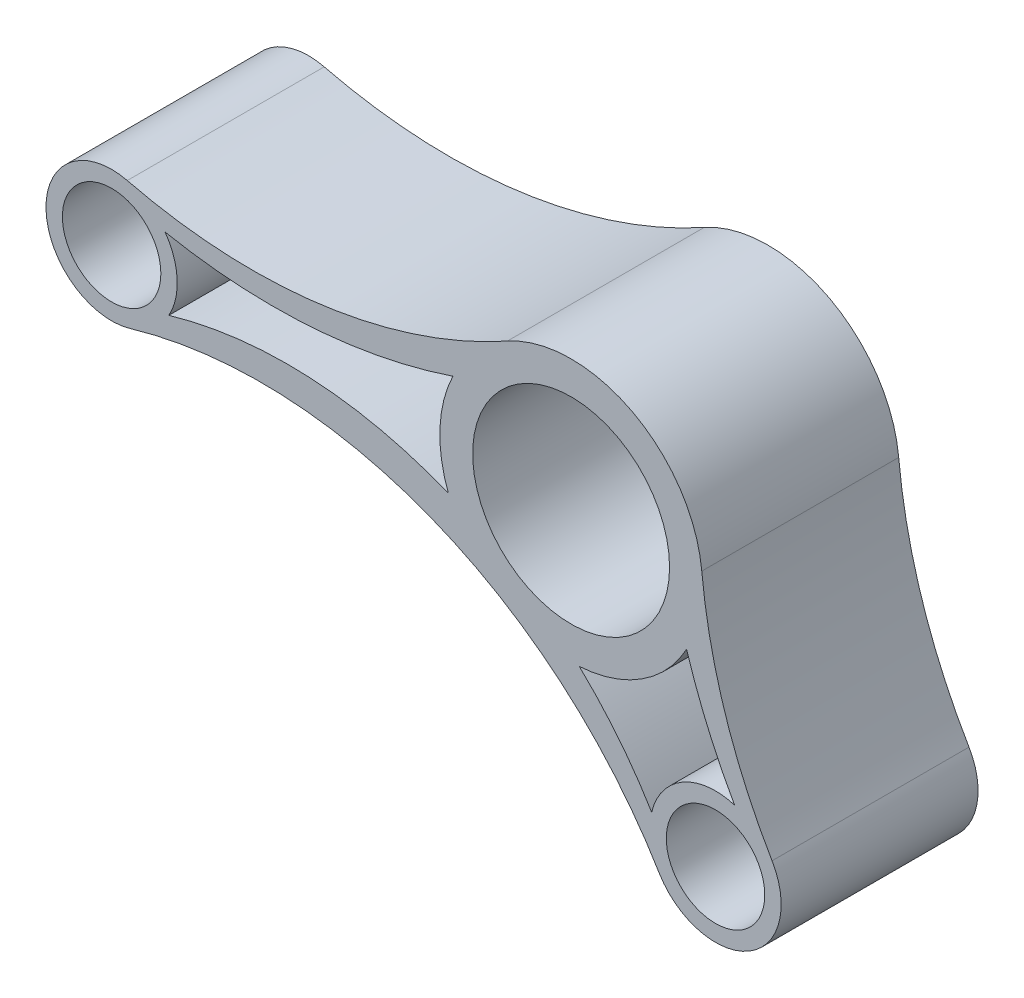
ISO-10303-21;
HEADER;
FILE_DESCRIPTION(('STEP AP214'),'2;1');
FILE_NAME('part.step','',(''),(''),'','','');
FILE_SCHEMA(('AUTOMOTIVE_DESIGN { 1 0 10303 214 1 1 1 1 }'));
ENDSEC;
DATA;
#1=APPLICATION_CONTEXT('core data for automotive mechanical design processes');
#2=APPLICATION_PROTOCOL_DEFINITION('international standard','automotive_design',2000,#1);
#3=PRODUCT_CONTEXT('',#1,'mechanical');
#4=PRODUCT('Part','Part','',(#3));
#5=PRODUCT_RELATED_PRODUCT_CATEGORY('part','',(#4));
#6=PRODUCT_DEFINITION_FORMATION('','',#4);
#7=PRODUCT_DEFINITION_CONTEXT('part definition',#1,'design');
#8=PRODUCT_DEFINITION('design','',#6,#7);
#9=PRODUCT_DEFINITION_SHAPE('','',#8);
#10=(LENGTH_UNIT() NAMED_UNIT(*) SI_UNIT(.MILLI.,.METRE.));
#11=(NAMED_UNIT(*) PLANE_ANGLE_UNIT() SI_UNIT($,.RADIAN.));
#12=(NAMED_UNIT(*) SI_UNIT($,.STERADIAN.) SOLID_ANGLE_UNIT());
#13=UNCERTAINTY_MEASURE_WITH_UNIT(LENGTH_MEASURE(1.E-05),#10,'distance_accuracy_value','');
#14=(GEOMETRIC_REPRESENTATION_CONTEXT(3) GLOBAL_UNCERTAINTY_ASSIGNED_CONTEXT((#13)) GLOBAL_UNIT_ASSIGNED_CONTEXT((#10,
#11,#12)) REPRESENTATION_CONTEXT('',''));
#15=CARTESIAN_POINT('',(0.,0.,0.));
#16=DIRECTION('',(0.,0.,1.));
#17=DIRECTION('',(1.,0.,0.));
#18=AXIS2_PLACEMENT_3D('',#15,#16,#17);
#19=CARTESIAN_POINT('',(-48.5714285714286,87.411763090162,15.));
#20=DIRECTION('',(0.,0.,-1.));
#21=DIRECTION('',(-1.,0.,0.));
#22=AXIS2_PLACEMENT_3D('',#19,#20,#21);
#23=CYLINDRICAL_SURFACE('',#22,80.);
#24=CARTESIAN_POINT('',(-48.5714285714286,87.411763090162,-15.));
#25=DIRECTION('',(0.,0.,1.));
#26=DIRECTION('',(1.,0.,0.));
#27=AXIS2_PLACEMENT_3D('',#24,#25,#26);
#28=CIRCLE('',#27,80.);
#29=CARTESIAN_POINT('',(-67.6190476190476,9.71241812112912,-15.));
#30=VERTEX_POINT('',#29);
#31=CARTESIAN_POINT('',(-9.71428571428572,17.4823526180324,-15.));
#32=VERTEX_POINT('',#31);
#33=EDGE_CURVE('E212',#30,#32,#28,.T.);
#34=ORIENTED_EDGE('',*,*,#33,.F.);
#35=DIRECTION('',(0.,0.,-1.));
#36=VECTOR('',#35,1.);
#37=CARTESIAN_POINT('',(-67.6190476190476,9.71241812112912,15.));
#38=LINE('',#37,#36);
#39=CARTESIAN_POINT('',(-67.6190476190476,9.71241812112912,15.));
#40=VERTEX_POINT('',#39);
#41=EDGE_CURVE('E11',#40,#30,#38,.T.);
#42=ORIENTED_EDGE('',*,*,#41,.F.);
#43=CARTESIAN_POINT('',(-48.5714285714286,87.411763090162,15.));
#44=DIRECTION('',(0.,0.,1.));
#45=DIRECTION('',(1.,0.,0.));
#46=AXIS2_PLACEMENT_3D('',#43,#44,#45);
#47=CIRCLE('',#46,80.);
#48=CARTESIAN_POINT('',(-9.71428571428572,17.4823526180324,15.));
#49=VERTEX_POINT('',#48);
#50=EDGE_CURVE('E277',#40,#49,#47,.T.);
#51=ORIENTED_EDGE('',*,*,#50,.T.);
#52=DIRECTION('',(0.,0.,-1.));
#53=VECTOR('',#52,1.);
#54=CARTESIAN_POINT('',(-9.71428571428572,17.4823526180324,15.));
#55=LINE('',#54,#53);
#56=EDGE_CURVE('E114',#49,#32,#55,.T.);
#57=ORIENTED_EDGE('',*,*,#56,.T.);
#58=EDGE_LOOP('',(#34,#42,#51,#57));
#59=FACE_BOUND('',#58,.T.);
#60=ADVANCED_FACE('F43',(#59),#23,.F.);
#61=CARTESIAN_POINT('',(-70.,0.,15.));
#62=DIRECTION('',(0.,0.,-1.));
#63=DIRECTION('',(-1.,0.,0.));
#64=AXIS2_PLACEMENT_3D('',#61,#62,#63);
#65=CYLINDRICAL_SURFACE('',#64,10.);
#66=CARTESIAN_POINT('',(-70.,0.,-15.));
#67=DIRECTION('',(0.,0.,1.));
#68=DIRECTION('',(1.,0.,0.));
#69=AXIS2_PLACEMENT_3D('',#66,#67,#68);
#70=CIRCLE('',#69,10.);
#71=CARTESIAN_POINT('',(-67.1780982450955,-9.5935848610239,-15.));
#72=VERTEX_POINT('',#71);
#73=EDGE_CURVE('E210',#30,#72,#70,.T.);
#74=ORIENTED_EDGE('',*,*,#73,.T.);
#75=DIRECTION('',(0.,0.,-1.));
#76=VECTOR('',#75,1.);
#77=CARTESIAN_POINT('',(-67.1780982450955,-9.5935848610239,15.));
#78=LINE('',#77,#76);
#79=CARTESIAN_POINT('',(-67.1780982450955,-9.5935848610239,15.));
#80=VERTEX_POINT('',#79);
#81=EDGE_CURVE('E53',#80,#72,#78,.T.);
#82=ORIENTED_EDGE('',*,*,#81,.F.);
#83=CARTESIAN_POINT('',(-70.,0.,15.));
#84=DIRECTION('',(0.,0.,1.));
#85=DIRECTION('',(1.,0.,0.));
#86=AXIS2_PLACEMENT_3D('',#83,#84,#85);
#87=CIRCLE('',#86,10.);
#88=EDGE_CURVE('E282',#40,#80,#87,.T.);
#89=ORIENTED_EDGE('',*,*,#88,.F.);
#90=ORIENTED_EDGE('',*,*,#41,.T.);
#91=EDGE_LOOP('',(#74,#82,#89,#90));
#92=FACE_BOUND('',#91,.T.);
#93=ADVANCED_FACE('F319',(#92),#65,.T.);
#94=CARTESIAN_POINT('',(-47.2376125822558,-77.3850099324316,15.));
#95=DIRECTION('',(0.,0.,-1.));
#96=DIRECTION('',(-1.,0.,0.));
#97=AXIS2_PLACEMENT_3D('',#94,#95,#96);
#98=CYLINDRICAL_SURFACE('',#97,70.6632880757908);
#99=CARTESIAN_POINT('',(-47.2376125822558,-77.3850099324316,-15.));
#100=DIRECTION('',(0.,0.,1.));
#101=DIRECTION('',(1.,0.,0.));
#102=AXIS2_PLACEMENT_3D('',#99,#100,#101);
#103=CIRCLE('',#102,70.6632880757908);
#104=CARTESIAN_POINT('',(13.4164653792441,-41.1305880183742,-15.));
#105=VERTEX_POINT('',#104);
#106=EDGE_CURVE('E215',#105,#72,#103,.T.);
#107=ORIENTED_EDGE('',*,*,#106,.F.);
#108=DIRECTION('',(0.,0.,-1.));
#109=VECTOR('',#108,1.);
#110=CARTESIAN_POINT('',(13.4164653792441,-41.1305880183742,15.));
#111=LINE('',#110,#109);
#112=CARTESIAN_POINT('',(13.4164653792441,-41.1305880183742,15.));
#113=VERTEX_POINT('',#112);
#114=EDGE_CURVE('E173',#113,#105,#111,.T.);
#115=ORIENTED_EDGE('',*,*,#114,.F.);
#116=CARTESIAN_POINT('',(-47.2376125822558,-77.3850099324316,15.));
#117=DIRECTION('',(0.,0.,1.));
#118=DIRECTION('',(1.,0.,0.));
#119=AXIS2_PLACEMENT_3D('',#116,#117,#118);
#120=CIRCLE('',#119,70.6632880757908);
#121=EDGE_CURVE('E162',#113,#80,#120,.T.);
#122=ORIENTED_EDGE('',*,*,#121,.T.);
#123=ORIENTED_EDGE('',*,*,#81,.T.);
#124=EDGE_LOOP('',(#107,#115,#122,#123));
#125=FACE_BOUND('',#124,.T.);
#126=ADVANCED_FACE('F292',(#125),#98,.F.);
#127=CARTESIAN_POINT('',(22.,-36.,15.));
#128=DIRECTION('',(0.,0.,-1.));
#129=DIRECTION('',(-1.,0.,0.));
#130=AXIS2_PLACEMENT_3D('',#127,#128,#129);
#131=CYLINDRICAL_SURFACE('',#130,10.);
#132=CARTESIAN_POINT('',(22.,-36.,-15.));
#133=DIRECTION('',(0.,0.,1.));
#134=DIRECTION('',(1.,0.,0.));
#135=AXIS2_PLACEMENT_3D('',#132,#133,#134);
#136=CIRCLE('',#135,10.);
#137=CARTESIAN_POINT('',(30.6141500030566,-30.9209824055395,-15.));
#138=VERTEX_POINT('',#137);
#139=EDGE_CURVE('E169',#105,#138,#136,.T.);
#140=ORIENTED_EDGE('',*,*,#139,.T.);
#141=DIRECTION('',(0.,0.,-1.));
#142=VECTOR('',#141,1.);
#143=CARTESIAN_POINT('',(30.6141500030566,-30.9209824055395,15.));
#144=LINE('',#143,#142);
#145=CARTESIAN_POINT('',(30.6141500030566,-30.9209824055395,15.));
#146=VERTEX_POINT('',#145);
#147=EDGE_CURVE('E166',#146,#138,#144,.T.);
#148=ORIENTED_EDGE('',*,*,#147,.F.);
#149=CARTESIAN_POINT('',(22.,-36.,15.));
#150=DIRECTION('',(0.,0.,1.));
#151=DIRECTION('',(1.,0.,0.));
#152=AXIS2_PLACEMENT_3D('',#149,#150,#151);
#153=CIRCLE('',#152,10.);
#154=EDGE_CURVE('E155',#113,#146,#153,.T.);
#155=ORIENTED_EDGE('',*,*,#154,.F.);
#156=ORIENTED_EDGE('',*,*,#114,.T.);
#157=EDGE_LOOP('',(#140,#148,#155,#156));
#158=FACE_BOUND('',#157,.T.);
#159=ADVANCED_FACE('F167',(#158),#131,.T.);
#160=CARTESIAN_POINT('',(99.5273500275096,9.71115835014474,15.));
#161=DIRECTION('',(0.,0.,-1.));
#162=DIRECTION('',(-1.,0.,0.));
#163=AXIS2_PLACEMENT_3D('',#160,#161,#162);
#164=CYLINDRICAL_SURFACE('',#163,80.);
#165=CARTESIAN_POINT('',(99.5273500275096,9.71115835014474,-15.));
#166=DIRECTION('',(0.,0.,1.));
#167=DIRECTION('',(1.,0.,0.));
#168=AXIS2_PLACEMENT_3D('',#165,#166,#167);
#169=CIRCLE('',#168,80.);
#170=CARTESIAN_POINT('',(19.9054700055019,1.94223167002895,-15.));
#171=VERTEX_POINT('',#170);
#172=EDGE_CURVE('E218',#171,#138,#169,.T.);
#173=ORIENTED_EDGE('',*,*,#172,.F.);
#174=DIRECTION('',(0.,0.,-1.));
#175=VECTOR('',#174,1.);
#176=CARTESIAN_POINT('',(19.9054700055019,1.94223167002895,15.));
#177=LINE('',#176,#175);
#178=CARTESIAN_POINT('',(19.9054700055019,1.94223167002895,15.));
#179=VERTEX_POINT('',#178);
#180=EDGE_CURVE('E107',#179,#171,#177,.T.);
#181=ORIENTED_EDGE('',*,*,#180,.F.);
#182=CARTESIAN_POINT('',(99.5273500275096,9.71115835014474,15.));
#183=DIRECTION('',(0.,0.,1.));
#184=DIRECTION('',(1.,0.,0.));
#185=AXIS2_PLACEMENT_3D('',#182,#183,#184);
#186=CIRCLE('',#185,80.);
#187=EDGE_CURVE('E160',#179,#146,#186,.T.);
#188=ORIENTED_EDGE('',*,*,#187,.T.);
#189=ORIENTED_EDGE('',*,*,#147,.T.);
#190=EDGE_LOOP('',(#173,#181,#188,#189));
#191=FACE_BOUND('',#190,.T.);
#192=ADVANCED_FACE('F175',(#191),#164,.F.);
#193=CARTESIAN_POINT('',(-43.1236043976895,-66.8714334607621,15.));
#194=DIRECTION('',(0.,0.,-1.));
#195=DIRECTION('',(-1.,0.,0.));
#196=AXIS2_PLACEMENT_3D('',#193,#194,#195);
#197=CYLINDRICAL_SURFACE('',#196,64.5703077117687);
#198=CARTESIAN_POINT('',(-43.1236043976895,-66.8714334607621,-15.));
#199=DIRECTION('',(0.,0.,1.));
#200=DIRECTION('',(1.,0.,0.));
#201=AXIS2_PLACEMENT_3D('',#198,#199,#200);
#202=CIRCLE('',#201,64.5703077117687);
#203=CARTESIAN_POINT('',(-18.6975414651907,-7.09943259405106,-15.));
#204=VERTEX_POINT('',#203);
#205=CARTESIAN_POINT('',(-61.2876120254974,-4.90859407384059,-15.));
#206=VERTEX_POINT('',#205);
#207=EDGE_CURVE('E202',#204,#206,#202,.T.);
#208=ORIENTED_EDGE('',*,*,#207,.T.);
#209=DIRECTION('',(0.,0.,-1.));
#210=VECTOR('',#209,1.);
#211=CARTESIAN_POINT('',(-61.2876120254974,-4.90859407384059,15.));
#212=LINE('',#211,#210);
#213=CARTESIAN_POINT('',(-61.2876120254974,-4.90859407384059,15.));
#214=VERTEX_POINT('',#213);
#215=EDGE_CURVE('E231',#214,#206,#212,.T.);
#216=ORIENTED_EDGE('',*,*,#215,.F.);
#217=CARTESIAN_POINT('',(-43.1236043976895,-66.8714334607621,15.));
#218=DIRECTION('',(0.,0.,1.));
#219=DIRECTION('',(1.,0.,0.));
#220=AXIS2_PLACEMENT_3D('',#217,#218,#219);
#221=CIRCLE('',#220,64.5703077117687);
#222=CARTESIAN_POINT('',(-18.6975414651907,-7.09943259405106,15.));
#223=VERTEX_POINT('',#222);
#224=EDGE_CURVE('E271',#223,#214,#221,.T.);
#225=ORIENTED_EDGE('',*,*,#224,.F.);
#226=DIRECTION('',(0.,0.,-1.));
#227=VECTOR('',#226,1.);
#228=CARTESIAN_POINT('',(-18.6975414651907,-7.09943259405106,15.));
#229=LINE('',#228,#227);
#230=EDGE_CURVE('E235',#223,#204,#229,.T.);
#231=ORIENTED_EDGE('',*,*,#230,.T.);
#232=EDGE_LOOP('',(#208,#216,#225,#231));
#233=FACE_BOUND('',#232,.T.);
#234=ADVANCED_FACE('F304',(#233),#197,.T.);
#235=CARTESIAN_POINT('',(-61.8505528905789,5.79538711483095,-15.));
#236=VERTEX_POINT('',#235);
#237=EDGE_CURVE('E207',#206,#236,#70,.T.);
#238=ORIENTED_EDGE('',*,*,#237,.T.);
#239=DIRECTION('',(0.,0.,-1.));
#240=VECTOR('',#239,1.);
#241=CARTESIAN_POINT('',(-61.8505528905789,5.79538711483095,15.));
#242=LINE('',#241,#240);
#243=CARTESIAN_POINT('',(-61.8505528905789,5.79538711483095,15.));
#244=VERTEX_POINT('',#243);
#245=EDGE_CURVE('E241',#244,#236,#242,.T.);
#246=ORIENTED_EDGE('',*,*,#245,.F.);
#247=EDGE_CURVE('E274',#214,#244,#87,.T.);
#248=ORIENTED_EDGE('',*,*,#247,.F.);
#249=ORIENTED_EDGE('',*,*,#215,.T.);
#250=EDGE_LOOP('',(#238,#246,#248,#249));
#251=FACE_BOUND('',#250,.T.);
#252=ADVANCED_FACE('F307',(#251),#65,.T.);
#253=CARTESIAN_POINT('',(-45.4196428571428,90.2111747109503,15.));
#254=DIRECTION('',(0.,0.,-1.));
#255=DIRECTION('',(-1.,0.,0.));
#256=AXIS2_PLACEMENT_3D('',#253,#254,#255);
#257=CYLINDRICAL_SURFACE('',#256,86.);
#258=CARTESIAN_POINT('',(-45.4196428571428,90.2111747109503,-15.));
#259=DIRECTION('',(0.,0.,1.));
#260=DIRECTION('',(1.,0.,0.));
#261=AXIS2_PLACEMENT_3D('',#258,#259,#260);
#262=CIRCLE('',#261,86.);
#263=CARTESIAN_POINT('',(-18.0106025115242,8.69587242155034,-15.));
#264=VERTEX_POINT('',#263);
#265=EDGE_CURVE('E209',#236,#264,#262,.T.);
#266=ORIENTED_EDGE('',*,*,#265,.T.);
#267=DIRECTION('',(0.,0.,-1.));
#268=VECTOR('',#267,1.);
#269=CARTESIAN_POINT('',(-18.0106025115242,8.69587242155034,15.));
#270=LINE('',#269,#268);
#271=CARTESIAN_POINT('',(-18.0106025115242,8.69587242155034,15.));
#272=VERTEX_POINT('',#271);
#273=EDGE_CURVE('E238',#272,#264,#270,.T.);
#274=ORIENTED_EDGE('',*,*,#273,.F.);
#275=CARTESIAN_POINT('',(-45.4196428571428,90.2111747109503,15.));
#276=DIRECTION('',(0.,0.,1.));
#277=DIRECTION('',(1.,0.,0.));
#278=AXIS2_PLACEMENT_3D('',#275,#276,#277);
#279=CIRCLE('',#278,86.);
#280=EDGE_CURVE('E278',#244,#272,#279,.T.);
#281=ORIENTED_EDGE('',*,*,#280,.F.);
#282=ORIENTED_EDGE('',*,*,#245,.T.);
#283=EDGE_LOOP('',(#266,#274,#281,#282));
#284=FACE_BOUND('',#283,.T.);
#285=ADVANCED_FACE('F328',(#284),#257,.T.);
#286=CARTESIAN_POINT('',(99.7304322690785,15.9637363866591,15.));
#287=DIRECTION('',(0.,0.,-1.));
#288=DIRECTION('',(-1.,0.,0.));
#289=AXIS2_PLACEMENT_3D('',#286,#287,#288);
#290=CYLINDRICAL_SURFACE('',#289,86.);
#291=CARTESIAN_POINT('',(99.7304322690785,15.9637363866591,-15.));
#292=DIRECTION('',(0.,0.,1.));
#293=DIRECTION('',(1.,0.,0.));
#294=AXIS2_PLACEMENT_3D('',#291,#292,#293);
#295=CIRCLE('',#294,86.);
#296=CARTESIAN_POINT('',(17.5914251516298,-9.51534345857296,-15.));
#297=VERTEX_POINT('',#296);
#298=CARTESIAN_POINT('',(24.9064543257824,-26.4316917246495,-15.));
#299=VERTEX_POINT('',#298);
#300=EDGE_CURVE('E193',#297,#299,#295,.T.);
#301=ORIENTED_EDGE('',*,*,#300,.T.);
#302=DIRECTION('',(0.,0.,-1.));
#303=VECTOR('',#302,1.);
#304=CARTESIAN_POINT('',(24.9064543257824,-26.4316917246495,15.));
#305=LINE('',#304,#303);
#306=CARTESIAN_POINT('',(24.9064543257824,-26.4316917246495,15.));
#307=VERTEX_POINT('',#306);
#308=EDGE_CURVE('E47',#307,#299,#305,.T.);
#309=ORIENTED_EDGE('',*,*,#308,.F.);
#310=CARTESIAN_POINT('',(99.7304322690785,15.9637363866591,15.));
#311=DIRECTION('',(0.,0.,1.));
#312=DIRECTION('',(1.,0.,0.));
#313=AXIS2_PLACEMENT_3D('',#310,#311,#312);
#314=CIRCLE('',#313,86.);
#315=CARTESIAN_POINT('',(17.5914251516298,-9.51534345857296,15.));
#316=VERTEX_POINT('',#315);
#317=EDGE_CURVE('E229',#316,#307,#314,.T.);
#318=ORIENTED_EDGE('',*,*,#317,.F.);
#319=DIRECTION('',(0.,0.,-1.));
#320=VECTOR('',#319,1.);
#321=CARTESIAN_POINT('',(17.5914251516298,-9.51534345857296,15.));
#322=LINE('',#321,#320);
#323=EDGE_CURVE('E192',#316,#297,#322,.T.);
#324=ORIENTED_EDGE('',*,*,#323,.T.);
#325=EDGE_LOOP('',(#301,#309,#318,#324));
#326=FACE_BOUND('',#325,.T.);
#327=ADVANCED_FACE('F45',(#326),#290,.T.);
#328=CARTESIAN_POINT('',(12.2699872800866,-33.6920024977648,-15.));
#329=VERTEX_POINT('',#328);
#330=EDGE_CURVE('E196',#299,#329,#136,.T.);
#331=ORIENTED_EDGE('',*,*,#330,.T.);
#332=DIRECTION('',(0.,0.,-1.));
#333=VECTOR('',#332,1.);
#334=CARTESIAN_POINT('',(12.2699872800866,-33.6920024977648,15.));
#335=LINE('',#334,#333);
#336=CARTESIAN_POINT('',(12.2699872800866,-33.6920024977648,15.));
#337=VERTEX_POINT('',#336);
#338=EDGE_CURVE('E250',#337,#329,#335,.T.);
#339=ORIENTED_EDGE('',*,*,#338,.F.);
#340=EDGE_CURVE('E122',#307,#337,#153,.T.);
#341=ORIENTED_EDGE('',*,*,#340,.F.);
#342=ORIENTED_EDGE('',*,*,#308,.T.);
#343=EDGE_LOOP('',(#331,#339,#341,#342));
#344=FACE_BOUND('',#343,.T.);
#345=ADVANCED_FACE('F256',(#344),#131,.T.);
#346=CARTESIAN_POINT('',(-43.1236043976895,-66.8714334607621,15.));
#347=DIRECTION('',(0.,0.,-1.));
#348=DIRECTION('',(-1.,0.,0.));
#349=AXIS2_PLACEMENT_3D('',#346,#347,#348);
#350=CYLINDRICAL_SURFACE('',#349,64.5703077117687);
#351=CARTESIAN_POINT('',(-43.1236043976895,-66.8714334607621,-15.));
#352=DIRECTION('',(0.,0.,1.));
#353=DIRECTION('',(1.,0.,0.));
#354=AXIS2_PLACEMENT_3D('',#351,#352,#353);
#355=CIRCLE('',#354,64.5703077117687);
#356=CARTESIAN_POINT('',(1.24693119324635,-19.9610912176491,-15.));
#357=VERTEX_POINT('',#356);
#358=EDGE_CURVE('E198',#329,#357,#355,.T.);
#359=ORIENTED_EDGE('',*,*,#358,.T.);
#360=DIRECTION('',(0.,0.,-1.));
#361=VECTOR('',#360,1.);
#362=CARTESIAN_POINT('',(1.24693119324635,-19.9610912176491,15.));
#363=LINE('',#362,#361);
#364=CARTESIAN_POINT('',(1.24693119324635,-19.9610912176491,15.));
#365=VERTEX_POINT('',#364);
#366=EDGE_CURVE('E248',#365,#357,#363,.T.);
#367=ORIENTED_EDGE('',*,*,#366,.F.);
#368=CARTESIAN_POINT('',(-43.1236043976895,-66.8714334607621,15.));
#369=DIRECTION('',(0.,0.,1.));
#370=DIRECTION('',(1.,0.,0.));
#371=AXIS2_PLACEMENT_3D('',#368,#369,#370);
#372=CIRCLE('',#371,64.5703077117687);
#373=EDGE_CURVE('E272',#337,#365,#372,.T.);
#374=ORIENTED_EDGE('',*,*,#373,.F.);
#375=ORIENTED_EDGE('',*,*,#338,.T.);
#376=EDGE_LOOP('',(#359,#367,#374,#375));
#377=FACE_BOUND('',#376,.T.);
#378=ADVANCED_FACE('F266',(#377),#350,.T.);
#379=CARTESIAN_POINT('',(-70.,0.,15.));
#380=DIRECTION('',(0.,0.,-1.));
#381=DIRECTION('',(-1.,0.,0.));
#382=AXIS2_PLACEMENT_3D('',#379,#380,#381);
#383=CYLINDRICAL_SURFACE('',#382,7.50000000000001);
#384=CARTESIAN_POINT('',(-70.,0.,15.));
#385=DIRECTION('',(0.,0.,1.));
#386=DIRECTION('',(1.,0.,0.));
#387=AXIS2_PLACEMENT_3D('',#384,#385,#386);
#388=CIRCLE('',#387,7.50000000000001);
#389=CARTESIAN_POINT('',(-62.5,0.,15.));
#390=VERTEX_POINT('',#389);
#391=EDGE_CURVE('E186',#390,#390,#388,.T.);
#392=ORIENTED_EDGE('',*,*,#391,.T.);
#393=EDGE_LOOP('',(#392));
#394=FACE_BOUND('',#393,.T.);
#395=CARTESIAN_POINT('',(-70.,0.,-15.));
#396=DIRECTION('',(0.,0.,1.));
#397=DIRECTION('',(1.,0.,0.));
#398=AXIS2_PLACEMENT_3D('',#395,#396,#397);
#399=CIRCLE('',#398,7.50000000000001);
#400=CARTESIAN_POINT('',(-62.5,0.,-15.));
#401=VERTEX_POINT('',#400);
#402=EDGE_CURVE('E223',#401,#401,#399,.T.);
#403=ORIENTED_EDGE('',*,*,#402,.F.);
#404=EDGE_LOOP('',(#403));
#405=FACE_BOUND('',#404,.T.);
#406=ADVANCED_FACE('F334',(#394,#405),#383,.F.);
#407=CARTESIAN_POINT('',(0.,0.,15.));
#408=DIRECTION('',(0.,0.,-1.));
#409=DIRECTION('',(-1.,0.,0.));
#410=AXIS2_PLACEMENT_3D('',#407,#408,#409);
#411=CYLINDRICAL_SURFACE('',#410,15.);
#412=CARTESIAN_POINT('',(0.,0.,15.));
#413=DIRECTION('',(0.,0.,1.));
#414=DIRECTION('',(1.,0.,0.));
#415=AXIS2_PLACEMENT_3D('',#412,#413,#414);
#416=CIRCLE('',#415,15.);
#417=CARTESIAN_POINT('',(15.,0.,15.));
#418=VERTEX_POINT('',#417);
#419=EDGE_CURVE('E177',#418,#418,#416,.T.);
#420=ORIENTED_EDGE('',*,*,#419,.T.);
#421=EDGE_LOOP('',(#420));
#422=FACE_BOUND('',#421,.T.);
#423=CARTESIAN_POINT('',(0.,0.,-15.));
#424=DIRECTION('',(0.,0.,1.));
#425=DIRECTION('',(1.,0.,0.));
#426=AXIS2_PLACEMENT_3D('',#423,#424,#425);
#427=CIRCLE('',#426,15.);
#428=CARTESIAN_POINT('',(15.,0.,-15.));
#429=VERTEX_POINT('',#428);
#430=EDGE_CURVE('E220',#429,#429,#427,.T.);
#431=ORIENTED_EDGE('',*,*,#430,.F.);
#432=EDGE_LOOP('',(#431));
#433=FACE_BOUND('',#432,.T.);
#434=ADVANCED_FACE('F339',(#422,#433),#411,.F.);
#435=CARTESIAN_POINT('',(0.,0.,15.));
#436=DIRECTION('',(0.,0.,-1.));
#437=DIRECTION('',(-1.,0.,0.));
#438=AXIS2_PLACEMENT_3D('',#435,#436,#437);
#439=CYLINDRICAL_SURFACE('',#438,20.);
#440=CARTESIAN_POINT('',(0.,0.,-15.));
#441=DIRECTION('',(0.,0.,1.));
#442=DIRECTION('',(1.,0.,0.));
#443=AXIS2_PLACEMENT_3D('',#440,#441,#442);
#444=CIRCLE('',#443,20.);
#445=EDGE_CURVE('E203',#171,#32,#444,.T.);
#446=ORIENTED_EDGE('',*,*,#445,.T.);
#447=ORIENTED_EDGE('',*,*,#56,.F.);
#448=CARTESIAN_POINT('',(0.,0.,15.));
#449=DIRECTION('',(0.,0.,1.));
#450=DIRECTION('',(1.,0.,0.));
#451=AXIS2_PLACEMENT_3D('',#448,#449,#450);
#452=CIRCLE('',#451,20.);
#453=EDGE_CURVE('E62',#179,#49,#452,.T.);
#454=ORIENTED_EDGE('',*,*,#453,.F.);
#455=ORIENTED_EDGE('',*,*,#180,.T.);
#456=EDGE_LOOP('',(#446,#447,#454,#455));
#457=FACE_BOUND('',#456,.T.);
#458=ADVANCED_FACE('F432',(#457),#439,.T.);
#459=EDGE_CURVE('E204',#264,#204,#444,.T.);
#460=ORIENTED_EDGE('',*,*,#459,.T.);
#461=ORIENTED_EDGE('',*,*,#230,.F.);
#462=EDGE_CURVE('E179',#272,#223,#452,.T.);
#463=ORIENTED_EDGE('',*,*,#462,.F.);
#464=ORIENTED_EDGE('',*,*,#273,.T.);
#465=EDGE_LOOP('',(#460,#461,#463,#464));
#466=FACE_BOUND('',#465,.T.);
#467=ADVANCED_FACE('F299',(#466),#439,.T.);
#468=EDGE_CURVE('E200',#357,#297,#444,.T.);
#469=ORIENTED_EDGE('',*,*,#468,.T.);
#470=ORIENTED_EDGE('',*,*,#323,.F.);
#471=EDGE_CURVE('E180',#365,#316,#452,.T.);
#472=ORIENTED_EDGE('',*,*,#471,.F.);
#473=ORIENTED_EDGE('',*,*,#366,.T.);
#474=EDGE_LOOP('',(#469,#470,#472,#473));
#475=FACE_BOUND('',#474,.T.);
#476=ADVANCED_FACE('F269',(#475),#439,.T.);
#477=CARTESIAN_POINT('',(22.,-36.,15.));
#478=DIRECTION('',(0.,0.,-1.));
#479=DIRECTION('',(-1.,0.,0.));
#480=AXIS2_PLACEMENT_3D('',#477,#478,#479);
#481=CYLINDRICAL_SURFACE('',#480,7.5);
#482=CARTESIAN_POINT('',(22.,-36.,15.));
#483=DIRECTION('',(0.,0.,1.));
#484=DIRECTION('',(1.,0.,0.));
#485=AXIS2_PLACEMENT_3D('',#482,#483,#484);
#486=CIRCLE('',#485,7.5);
#487=CARTESIAN_POINT('',(29.5,-36.,15.));
#488=VERTEX_POINT('',#487);
#489=EDGE_CURVE('E189',#488,#488,#486,.T.);
#490=ORIENTED_EDGE('',*,*,#489,.T.);
#491=EDGE_LOOP('',(#490));
#492=FACE_BOUND('',#491,.T.);
#493=CARTESIAN_POINT('',(22.,-36.,-15.));
#494=DIRECTION('',(0.,0.,1.));
#495=DIRECTION('',(1.,0.,0.));
#496=AXIS2_PLACEMENT_3D('',#493,#494,#495);
#497=CIRCLE('',#496,7.5);
#498=CARTESIAN_POINT('',(29.5,-36.,-15.));
#499=VERTEX_POINT('',#498);
#500=EDGE_CURVE('E226',#499,#499,#497,.T.);
#501=ORIENTED_EDGE('',*,*,#500,.F.);
#502=EDGE_LOOP('',(#501));
#503=FACE_BOUND('',#502,.T.);
#504=ADVANCED_FACE('F309',(#492,#503),#481,.F.);
#505=CARTESIAN_POINT('',(0.,0.,15.));
#506=DIRECTION('',(0.,0.,1.));
#507=DIRECTION('',(1.,0.,0.));
#508=AXIS2_PLACEMENT_3D('',#505,#506,#507);
#509=PLANE('',#508);
#510=ORIENTED_EDGE('',*,*,#317,.T.);
#511=ORIENTED_EDGE('',*,*,#340,.T.);
#512=ORIENTED_EDGE('',*,*,#373,.T.);
#513=ORIENTED_EDGE('',*,*,#471,.T.);
#514=EDGE_LOOP('',(#510,#511,#512,#513));
#515=FACE_BOUND('',#514,.T.);
#516=ORIENTED_EDGE('',*,*,#224,.T.);
#517=ORIENTED_EDGE('',*,*,#247,.T.);
#518=ORIENTED_EDGE('',*,*,#280,.T.);
#519=ORIENTED_EDGE('',*,*,#462,.T.);
#520=EDGE_LOOP('',(#516,#517,#518,#519));
#521=FACE_BOUND('',#520,.T.);
#522=ORIENTED_EDGE('',*,*,#50,.F.);
#523=ORIENTED_EDGE('',*,*,#88,.T.);
#524=ORIENTED_EDGE('',*,*,#121,.F.);
#525=ORIENTED_EDGE('',*,*,#154,.T.);
#526=ORIENTED_EDGE('',*,*,#187,.F.);
#527=ORIENTED_EDGE('',*,*,#453,.T.);
#528=EDGE_LOOP('',(#522,#523,#524,#525,#526,#527));
#529=FACE_BOUND('',#528,.T.);
#530=ORIENTED_EDGE('',*,*,#419,.F.);
#531=EDGE_LOOP('',(#530));
#532=FACE_BOUND('',#531,.T.);
#533=ORIENTED_EDGE('',*,*,#391,.F.);
#534=EDGE_LOOP('',(#533));
#535=FACE_BOUND('',#534,.T.);
#536=ORIENTED_EDGE('',*,*,#489,.F.);
#537=EDGE_LOOP('',(#536));
#538=FACE_BOUND('',#537,.T.);
#539=ADVANCED_FACE('F157',(#515,#521,#529,#532,#535,#538),#509,.T.);
#540=CARTESIAN_POINT('',(0.,0.,-15.));
#541=DIRECTION('',(0.,0.,1.));
#542=DIRECTION('',(1.,0.,0.));
#543=AXIS2_PLACEMENT_3D('',#540,#541,#542);
#544=PLANE('',#543);
#545=ORIENTED_EDGE('',*,*,#300,.F.);
#546=ORIENTED_EDGE('',*,*,#468,.F.);
#547=ORIENTED_EDGE('',*,*,#358,.F.);
#548=ORIENTED_EDGE('',*,*,#330,.F.);
#549=EDGE_LOOP('',(#545,#546,#547,#548));
#550=FACE_BOUND('',#549,.T.);
#551=ORIENTED_EDGE('',*,*,#207,.F.);
#552=ORIENTED_EDGE('',*,*,#459,.F.);
#553=ORIENTED_EDGE('',*,*,#265,.F.);
#554=ORIENTED_EDGE('',*,*,#237,.F.);
#555=EDGE_LOOP('',(#551,#552,#553,#554));
#556=FACE_BOUND('',#555,.T.);
#557=ORIENTED_EDGE('',*,*,#33,.T.);
#558=ORIENTED_EDGE('',*,*,#445,.F.);
#559=ORIENTED_EDGE('',*,*,#172,.T.);
#560=ORIENTED_EDGE('',*,*,#139,.F.);
#561=ORIENTED_EDGE('',*,*,#106,.T.);
#562=ORIENTED_EDGE('',*,*,#73,.F.);
#563=EDGE_LOOP('',(#557,#558,#559,#560,#561,#562));
#564=FACE_BOUND('',#563,.T.);
#565=ORIENTED_EDGE('',*,*,#430,.T.);
#566=EDGE_LOOP('',(#565));
#567=FACE_BOUND('',#566,.T.);
#568=ORIENTED_EDGE('',*,*,#402,.T.);
#569=EDGE_LOOP('',(#568));
#570=FACE_BOUND('',#569,.T.);
#571=ORIENTED_EDGE('',*,*,#500,.T.);
#572=EDGE_LOOP('',(#571));
#573=FACE_BOUND('',#572,.T.);
#574=ADVANCED_FACE('F263',(#550,#556,#564,#567,#570,#573),#544,.F.);
#575=CLOSED_SHELL('',(#60,#93,#126,#159,#192,#234,#252,#285,#327,#345,#378,#406,#434,#458,#467,
#476,#504,#539,#574));
#576=MANIFOLD_SOLID_BREP('B2',#575);
#577=ADVANCED_BREP_SHAPE_REPRESENTATION('',(#18,#576),#14);
#578=SHAPE_DEFINITION_REPRESENTATION(#9,#577);
ENDSEC;
END-ISO-10303-21;
